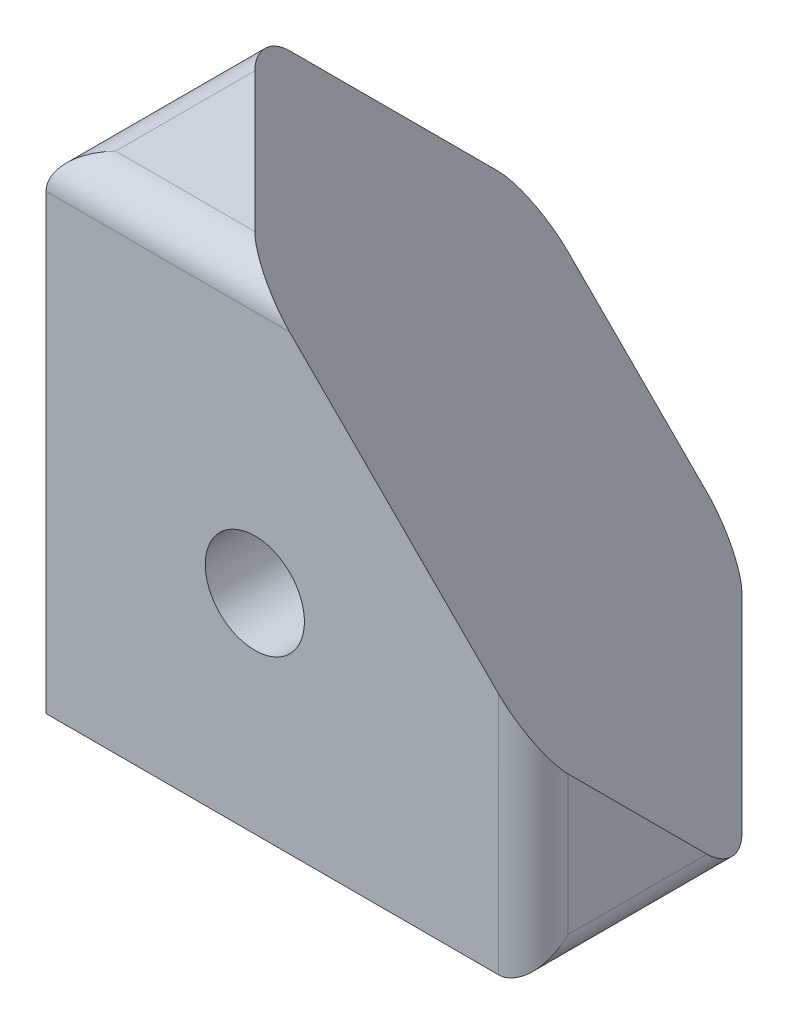
ISO-10303-21;
HEADER;
FILE_DESCRIPTION(('STEP AP214'),'2;1');
FILE_NAME('part.step','',(''),(''),'','','');
FILE_SCHEMA(('AUTOMOTIVE_DESIGN { 1 0 10303 214 1 1 1 1 }'));
ENDSEC;
DATA;
#1=APPLICATION_CONTEXT('core data for automotive mechanical design processes');
#2=APPLICATION_PROTOCOL_DEFINITION('international standard','automotive_design',2000,#1);
#3=PRODUCT_CONTEXT('',#1,'mechanical');
#4=PRODUCT('Part','Part','',(#3));
#5=PRODUCT_RELATED_PRODUCT_CATEGORY('part','',(#4));
#6=PRODUCT_DEFINITION_FORMATION('','',#4);
#7=PRODUCT_DEFINITION_CONTEXT('part definition',#1,'design');
#8=PRODUCT_DEFINITION('design','',#6,#7);
#9=PRODUCT_DEFINITION_SHAPE('','',#8);
#10=(LENGTH_UNIT() NAMED_UNIT(*) SI_UNIT(.MILLI.,.METRE.));
#11=(NAMED_UNIT(*) PLANE_ANGLE_UNIT() SI_UNIT($,.RADIAN.));
#12=(NAMED_UNIT(*) SI_UNIT($,.STERADIAN.) SOLID_ANGLE_UNIT());
#13=UNCERTAINTY_MEASURE_WITH_UNIT(LENGTH_MEASURE(1.E-05),#10,'distance_accuracy_value','');
#14=(GEOMETRIC_REPRESENTATION_CONTEXT(3) GLOBAL_UNCERTAINTY_ASSIGNED_CONTEXT((#13)) GLOBAL_UNIT_ASSIGNED_CONTEXT((#10,
#11,#12)) REPRESENTATION_CONTEXT('',''));
#15=CARTESIAN_POINT('',(0.,0.,0.));
#16=DIRECTION('',(0.,0.,1.));
#17=DIRECTION('',(1.,0.,0.));
#18=AXIS2_PLACEMENT_3D('',#15,#16,#17);
#19=CARTESIAN_POINT('',(0.,0.,0.));
#20=DIRECTION('',(-1.,0.,0.));
#21=DIRECTION('',(0.,0.,1.));
#22=AXIS2_PLACEMENT_3D('',#19,#20,#21);
#23=PLANE('',#22);
#24=CARTESIAN_POINT('',(0.,12.,-12.));
#25=DIRECTION('',(-1.,0.,0.));
#26=DIRECTION('',(0.,0.,1.));
#27=AXIS2_PLACEMENT_3D('',#24,#25,#26);
#28=CIRCLE('',#27,2.85);
#29=CARTESIAN_POINT('',(0.,12.,-9.15));
#30=VERTEX_POINT('',#29);
#31=EDGE_CURVE('E308',#30,#30,#28,.T.);
#32=ORIENTED_EDGE('',*,*,#31,.F.);
#33=EDGE_LOOP('',(#32));
#34=FACE_BOUND('',#33,.T.);
#35=DIRECTION('',(0.,0.707106781186548,0.707106781186548));
#36=VECTOR('',#35,1.);
#37=CARTESIAN_POINT('',(0.,40.,0.));
#38=LINE('',#37,#36);
#39=CARTESIAN_POINT('',(0.,14.,-26.));
#40=VERTEX_POINT('',#39);
#41=CARTESIAN_POINT('',(0.,26.,-14.));
#42=VERTEX_POINT('',#41);
#43=EDGE_CURVE('E139',#40,#42,#38,.T.);
#44=ORIENTED_EDGE('',*,*,#43,.F.);
#45=DIRECTION('',(0.,1.,0.));
#46=VECTOR('',#45,1.);
#47=CARTESIAN_POINT('',(0.,0.,-26.));
#48=LINE('',#47,#46);
#49=CARTESIAN_POINT('',(0.,0.,-26.));
#50=VERTEX_POINT('',#49);
#51=EDGE_CURVE('E155',#40,#50,#48,.F.);
#52=ORIENTED_EDGE('',*,*,#51,.T.);
#53=DIRECTION('',(0.,0.,-1.));
#54=VECTOR('',#53,1.);
#55=CARTESIAN_POINT('',(0.,0.,-40.));
#56=LINE('',#55,#54);
#57=CARTESIAN_POINT('',(0.,0.,0.));
#58=VERTEX_POINT('',#57);
#59=EDGE_CURVE('E140',#58,#50,#56,.T.);
#60=ORIENTED_EDGE('',*,*,#59,.F.);
#61=DIRECTION('',(0.,-1.,0.));
#62=VECTOR('',#61,1.);
#63=CARTESIAN_POINT('',(0.,0.,0.));
#64=LINE('',#63,#62);
#65=CARTESIAN_POINT('',(0.,26.,0.));
#66=VERTEX_POINT('',#65);
#67=EDGE_CURVE('E128',#66,#58,#64,.T.);
#68=ORIENTED_EDGE('',*,*,#67,.F.);
#69=DIRECTION('',(0.,0.,1.));
#70=VECTOR('',#69,1.);
#71=CARTESIAN_POINT('',(0.,26.,-12.));
#72=LINE('',#71,#70);
#73=EDGE_CURVE('E238',#66,#42,#72,.F.);
#74=ORIENTED_EDGE('',*,*,#73,.T.);
#75=EDGE_LOOP('',(#44,#52,#60,#68,#74));
#76=FACE_BOUND('',#75,.T.);
#77=ADVANCED_FACE('F49',(#34,#76),#23,.T.);
#78=CARTESIAN_POINT('',(0.,0.,0.));
#79=DIRECTION('',(0.,0.,-1.));
#80=DIRECTION('',(-1.,0.,0.));
#81=AXIS2_PLACEMENT_3D('',#78,#79,#80);
#82=PLANE('',#81);
#83=CARTESIAN_POINT('',(12.,12.,0.));
#84=DIRECTION('',(0.,0.,-1.));
#85=DIRECTION('',(-1.,0.,0.));
#86=AXIS2_PLACEMENT_3D('',#83,#84,#85);
#87=CIRCLE('',#86,2.85);
#88=CARTESIAN_POINT('',(9.15,12.,0.));
#89=VERTEX_POINT('',#88);
#90=EDGE_CURVE('E317',#89,#89,#87,.T.);
#91=ORIENTED_EDGE('',*,*,#90,.T.);
#92=EDGE_LOOP('',(#91));
#93=FACE_BOUND('',#92,.T.);
#94=DIRECTION('',(1.,0.,0.));
#95=VECTOR('',#94,1.);
#96=CARTESIAN_POINT('',(40.,0.,0.));
#97=LINE('',#96,#95);
#98=CARTESIAN_POINT('',(26.,0.,0.));
#99=VERTEX_POINT('',#98);
#100=EDGE_CURVE('E130',#58,#99,#97,.T.);
#101=ORIENTED_EDGE('',*,*,#100,.T.);
#102=DIRECTION('',(0.,-1.,0.));
#103=VECTOR('',#102,1.);
#104=CARTESIAN_POINT('',(26.,0.,0.));
#105=LINE('',#104,#103);
#106=CARTESIAN_POINT('',(26.,14.,0.));
#107=VERTEX_POINT('',#106);
#108=EDGE_CURVE('E212',#99,#107,#105,.F.);
#109=ORIENTED_EDGE('',*,*,#108,.T.);
#110=DIRECTION('',(-0.707106781186548,0.707106781186548,0.));
#111=VECTOR('',#110,1.);
#112=CARTESIAN_POINT('',(0.,40.,0.));
#113=LINE('',#112,#111);
#114=CARTESIAN_POINT('',(14.,26.,0.));
#115=VERTEX_POINT('',#114);
#116=EDGE_CURVE('E53',#107,#115,#113,.T.);
#117=ORIENTED_EDGE('',*,*,#116,.T.);
#118=DIRECTION('',(1.,0.,0.));
#119=VECTOR('',#118,1.);
#120=CARTESIAN_POINT('',(0.,26.,0.));
#121=LINE('',#120,#119);
#122=EDGE_CURVE('E134',#115,#66,#121,.F.);
#123=ORIENTED_EDGE('',*,*,#122,.T.);
#124=ORIENTED_EDGE('',*,*,#67,.T.);
#125=EDGE_LOOP('',(#101,#109,#117,#123,#124));
#126=FACE_BOUND('',#125,.T.);
#127=ADVANCED_FACE('F129',(#93,#126),#82,.F.);
#128=CARTESIAN_POINT('',(0.,40.,0.));
#129=DIRECTION('',(0.577350269189626,0.577350269189626,-0.577350269189626));
#130=DIRECTION('',(0.707106781186547,-0.707106781186547,0.));
#131=AXIS2_PLACEMENT_3D('',#128,#129,#130);
#132=PLANE('',#131);
#133=DIRECTION('',(0.707106781186548,-0.707106781186548,0.));
#134=VECTOR('',#133,1.);
#135=CARTESIAN_POINT('',(-14.,26.,-28.));
#136=LINE('',#135,#134);
#137=CARTESIAN_POINT('',(2.,9.99999999999997,-28.));
#138=VERTEX_POINT('',#137);
#139=CARTESIAN_POINT('',(9.99999999999998,2.,-28.));
#140=VERTEX_POINT('',#139);
#141=EDGE_CURVE('E320',#138,#140,#136,.T.);
#142=ORIENTED_EDGE('',*,*,#141,.F.);
#143=CARTESIAN_POINT('',(2.,12.,-26.));
#144=DIRECTION('',(0.577350269189626,0.577350269189626,-0.577350269189626));
#145=DIRECTION('',(0.408248290463863,-0.816496580927726,-0.408248290463863));
#146=AXIS2_PLACEMENT_3D('',#143,#144,#145);
#147=ELLIPSE('',#146,3.46410161513776,2.);
#148=EDGE_CURVE('E225',#138,#40,#147,.T.);
#149=ORIENTED_EDGE('',*,*,#148,.T.);
#150=ORIENTED_EDGE('',*,*,#43,.T.);
#151=CARTESIAN_POINT('',(2.,26.,-12.));
#152=DIRECTION('',(0.577350269189626,0.577350269189626,-0.577350269189626));
#153=DIRECTION('',(-0.408248290463863,-0.408248290463863,-0.816496580927726));
#154=AXIS2_PLACEMENT_3D('',#151,#152,#153);
#155=ELLIPSE('',#154,3.46410161513775,2.);
#156=CARTESIAN_POINT('',(2.,28.,-9.99999999999999));
#157=VERTEX_POINT('',#156);
#158=EDGE_CURVE('E220',#42,#157,#155,.T.);
#159=ORIENTED_EDGE('',*,*,#158,.T.);
#160=DIRECTION('',(-0.707106781186548,0.,-0.707106781186547));
#161=VECTOR('',#160,1.);
#162=CARTESIAN_POINT('',(5.99999999999999,28.,-6.));
#163=LINE('',#162,#161);
#164=CARTESIAN_POINT('',(10.,28.,-2.));
#165=VERTEX_POINT('',#164);
#166=EDGE_CURVE('E278',#165,#157,#163,.T.);
#167=ORIENTED_EDGE('',*,*,#166,.F.);
#168=CARTESIAN_POINT('',(12.,26.,-2.));
#169=DIRECTION('',(0.577350269189626,0.577350269189626,-0.577350269189626));
#170=DIRECTION('',(0.816496580927726,-0.408248290463863,0.408248290463863));
#171=AXIS2_PLACEMENT_3D('',#168,#169,#170);
#172=ELLIPSE('',#171,3.46410161513776,2.);
#173=EDGE_CURVE('E331',#165,#115,#172,.T.);
#174=ORIENTED_EDGE('',*,*,#173,.T.);
#175=ORIENTED_EDGE('',*,*,#116,.F.);
#176=CARTESIAN_POINT('',(26.,12.,-2.));
#177=DIRECTION('',(0.577350269189626,0.577350269189626,-0.577350269189626));
#178=DIRECTION('',(0.408248290463863,-0.816496580927726,-0.408248290463863));
#179=AXIS2_PLACEMENT_3D('',#176,#177,#178);
#180=ELLIPSE('',#179,3.46410161513776,2.);
#181=CARTESIAN_POINT('',(28.,10.,-1.99999999999999));
#182=VERTEX_POINT('',#181);
#183=EDGE_CURVE('E211',#107,#182,#180,.T.);
#184=ORIENTED_EDGE('',*,*,#183,.T.);
#185=DIRECTION('',(0.,0.707106781186548,0.707106781186547));
#186=VECTOR('',#185,1.);
#187=CARTESIAN_POINT('',(28.,26.,14.));
#188=LINE('',#187,#186);
#189=CARTESIAN_POINT('',(28.,2.,-9.99999999999999));
#190=VERTEX_POINT('',#189);
#191=EDGE_CURVE('E148',#190,#182,#188,.T.);
#192=ORIENTED_EDGE('',*,*,#191,.F.);
#193=CARTESIAN_POINT('',(26.,2.,-12.));
#194=DIRECTION('',(0.577350269189626,0.577350269189626,-0.577350269189626));
#195=DIRECTION('',(0.408248290463863,0.408248290463863,0.816496580927726));
#196=AXIS2_PLACEMENT_3D('',#193,#194,#195);
#197=ELLIPSE('',#196,3.46410161513775,2.);
#198=CARTESIAN_POINT('',(26.,0.,-14.));
#199=VERTEX_POINT('',#198);
#200=EDGE_CURVE('E221',#190,#199,#197,.T.);
#201=ORIENTED_EDGE('',*,*,#200,.T.);
#202=DIRECTION('',(-0.707106781186548,0.,-0.707106781186548));
#203=VECTOR('',#202,1.);
#204=CARTESIAN_POINT('',(20.,0.,-20.));
#205=LINE('',#204,#203);
#206=CARTESIAN_POINT('',(14.,0.,-26.));
#207=VERTEX_POINT('',#206);
#208=EDGE_CURVE('E157',#199,#207,#205,.T.);
#209=ORIENTED_EDGE('',*,*,#208,.T.);
#210=CARTESIAN_POINT('',(12.,2.,-26.));
#211=DIRECTION('',(0.577350269189626,0.577350269189626,-0.577350269189626));
#212=DIRECTION('',(0.816496580927726,-0.408248290463863,0.408248290463863));
#213=AXIS2_PLACEMENT_3D('',#210,#211,#212);
#214=ELLIPSE('',#213,3.46410161513776,2.);
#215=EDGE_CURVE('E227',#207,#140,#214,.T.);
#216=ORIENTED_EDGE('',*,*,#215,.T.);
#217=EDGE_LOOP('',(#142,#149,#150,#159,#167,#174,#175,#184,#192,#201,#209,#216));
#218=FACE_BOUND('',#217,.T.);
#219=ADVANCED_FACE('F260',(#218),#132,.T.);
#220=CARTESIAN_POINT('',(40.,0.,0.));
#221=DIRECTION('',(0.,-1.,0.));
#222=DIRECTION('',(-1.,0.,0.));
#223=AXIS2_PLACEMENT_3D('',#220,#221,#222);
#224=PLANE('',#223);
#225=CARTESIAN_POINT('',(12.,1.26565424807268E-13,-12.));
#226=DIRECTION('',(0.,1.,0.));
#227=DIRECTION('',(0.,0.,1.));
#228=AXIS2_PLACEMENT_3D('',#225,#226,#227);
#229=CIRCLE('',#228,2.85);
#230=CARTESIAN_POINT('',(12.,1.26565424807268E-13,-9.15));
#231=VERTEX_POINT('',#230);
#232=EDGE_CURVE('E456',#231,#231,#229,.T.);
#233=ORIENTED_EDGE('',*,*,#232,.T.);
#234=EDGE_LOOP('',(#233));
#235=FACE_BOUND('',#234,.T.);
#236=ORIENTED_EDGE('',*,*,#208,.F.);
#237=DIRECTION('',(0.,0.,-1.));
#238=VECTOR('',#237,1.);
#239=CARTESIAN_POINT('',(26.,0.,0.));
#240=LINE('',#239,#238);
#241=EDGE_CURVE('E12',#199,#99,#240,.F.);
#242=ORIENTED_EDGE('',*,*,#241,.T.);
#243=ORIENTED_EDGE('',*,*,#100,.F.);
#244=ORIENTED_EDGE('',*,*,#59,.T.);
#245=DIRECTION('',(-1.,0.,0.));
#246=VECTOR('',#245,1.);
#247=CARTESIAN_POINT('',(12.,0.,-26.));
#248=LINE('',#247,#246);
#249=EDGE_CURVE('E60',#50,#207,#248,.F.);
#250=ORIENTED_EDGE('',*,*,#249,.T.);
#251=EDGE_LOOP('',(#236,#242,#243,#244,#250));
#252=FACE_BOUND('',#251,.T.);
#253=ADVANCED_FACE('F144',(#235,#252),#224,.T.);
#254=CARTESIAN_POINT('',(28.,0.,-20.));
#255=DIRECTION('',(-1.,0.,0.));
#256=DIRECTION('',(0.,0.,1.));
#257=AXIS2_PLACEMENT_3D('',#254,#255,#256);
#258=PLANE('',#257);
#259=ORIENTED_EDGE('',*,*,#191,.T.);
#260=DIRECTION('',(0.,-1.,0.));
#261=VECTOR('',#260,1.);
#262=CARTESIAN_POINT('',(28.,0.,-2.));
#263=LINE('',#262,#261);
#264=CARTESIAN_POINT('',(28.,2.,-2.));
#265=VERTEX_POINT('',#264);
#266=EDGE_CURVE('E214',#182,#265,#263,.T.);
#267=ORIENTED_EDGE('',*,*,#266,.T.);
#268=DIRECTION('',(0.,0.,-1.));
#269=VECTOR('',#268,1.);
#270=CARTESIAN_POINT('',(28.,2.,-12.));
#271=LINE('',#270,#269);
#272=EDGE_CURVE('E394',#265,#190,#271,.T.);
#273=ORIENTED_EDGE('',*,*,#272,.T.);
#274=EDGE_LOOP('',(#259,#267,#273));
#275=FACE_BOUND('',#274,.T.);
#276=ADVANCED_FACE('F420',(#275),#258,.F.);
#277=CARTESIAN_POINT('',(0.,28.,-20.));
#278=DIRECTION('',(0.,-1.,0.));
#279=DIRECTION('',(1.,0.,0.));
#280=AXIS2_PLACEMENT_3D('',#277,#278,#279);
#281=PLANE('',#280);
#282=ORIENTED_EDGE('',*,*,#166,.T.);
#283=DIRECTION('',(0.,0.,1.));
#284=VECTOR('',#283,1.);
#285=CARTESIAN_POINT('',(2.,28.,0.));
#286=LINE('',#285,#284);
#287=CARTESIAN_POINT('',(2.,28.,-2.));
#288=VERTEX_POINT('',#287);
#289=EDGE_CURVE('E388',#157,#288,#286,.T.);
#290=ORIENTED_EDGE('',*,*,#289,.T.);
#291=DIRECTION('',(1.,0.,0.));
#292=VECTOR('',#291,1.);
#293=CARTESIAN_POINT('',(0.,28.,-2.));
#294=LINE('',#293,#292);
#295=EDGE_CURVE('E390',#288,#165,#294,.T.);
#296=ORIENTED_EDGE('',*,*,#295,.T.);
#297=EDGE_LOOP('',(#282,#290,#296));
#298=FACE_BOUND('',#297,.T.);
#299=ADVANCED_FACE('F262',(#298),#281,.F.);
#300=CARTESIAN_POINT('',(20.,0.,-28.));
#301=DIRECTION('',(0.,0.,1.));
#302=DIRECTION('',(1.,0.,0.));
#303=AXIS2_PLACEMENT_3D('',#300,#301,#302);
#304=PLANE('',#303);
#305=DIRECTION('',(-1.,0.,0.));
#306=VECTOR('',#305,1.);
#307=CARTESIAN_POINT('',(0.,2.,-28.));
#308=LINE('',#307,#306);
#309=CARTESIAN_POINT('',(2.,2.,-28.));
#310=VERTEX_POINT('',#309);
#311=EDGE_CURVE('E324',#140,#310,#308,.T.);
#312=ORIENTED_EDGE('',*,*,#311,.T.);
#313=DIRECTION('',(0.,1.,0.));
#314=VECTOR('',#313,1.);
#315=CARTESIAN_POINT('',(2.,12.,-28.));
#316=LINE('',#315,#314);
#317=EDGE_CURVE('E327',#310,#138,#316,.T.);
#318=ORIENTED_EDGE('',*,*,#317,.T.);
#319=ORIENTED_EDGE('',*,*,#141,.T.);
#320=EDGE_LOOP('',(#312,#318,#319));
#321=FACE_BOUND('',#320,.T.);
#322=ADVANCED_FACE('F191',(#321),#304,.F.);
#323=CARTESIAN_POINT('',(20.,2.,-26.));
#324=DIRECTION('',(1.,0.,0.));
#325=DIRECTION('',(0.,0.,-1.));
#326=AXIS2_PLACEMENT_3D('',#323,#324,#325);
#327=CYLINDRICAL_SURFACE('',#326,2.);
#328=ORIENTED_EDGE('',*,*,#215,.F.);
#329=ORIENTED_EDGE('',*,*,#249,.F.);
#330=CARTESIAN_POINT('',(2.,2.,-26.));
#331=DIRECTION('',(0.707106781186547,-0.707106781186547,0.));
#332=DIRECTION('',(0.707106781186547,0.707106781186547,0.));
#333=AXIS2_PLACEMENT_3D('',#330,#331,#332);
#334=ELLIPSE('',#333,2.82842712474619,2.);
#335=EDGE_CURVE('E306',#310,#50,#334,.F.);
#336=ORIENTED_EDGE('',*,*,#335,.F.);
#337=ORIENTED_EDGE('',*,*,#311,.F.);
#338=EDGE_LOOP('',(#328,#329,#336,#337));
#339=FACE_BOUND('',#338,.T.);
#340=ADVANCED_FACE('F187',(#339),#327,.T.);
#341=CARTESIAN_POINT('',(2.,0.,-26.));
#342=DIRECTION('',(0.,-1.,0.));
#343=DIRECTION('',(0.,0.,-1.));
#344=AXIS2_PLACEMENT_3D('',#341,#342,#343);
#345=CYLINDRICAL_SURFACE('',#344,2.);
#346=ORIENTED_EDGE('',*,*,#335,.T.);
#347=ORIENTED_EDGE('',*,*,#51,.F.);
#348=ORIENTED_EDGE('',*,*,#148,.F.);
#349=ORIENTED_EDGE('',*,*,#317,.F.);
#350=EDGE_LOOP('',(#346,#347,#348,#349));
#351=FACE_BOUND('',#350,.T.);
#352=ADVANCED_FACE('F182',(#351),#345,.T.);
#353=CARTESIAN_POINT('',(0.,26.,-2.));
#354=DIRECTION('',(1.,0.,0.));
#355=DIRECTION('',(0.,1.,0.));
#356=AXIS2_PLACEMENT_3D('',#353,#354,#355);
#357=CYLINDRICAL_SURFACE('',#356,2.);
#358=ORIENTED_EDGE('',*,*,#173,.F.);
#359=ORIENTED_EDGE('',*,*,#295,.F.);
#360=CARTESIAN_POINT('',(2.,26.,-2.));
#361=DIRECTION('',(0.707106781186547,0.,0.707106781186547));
#362=DIRECTION('',(0.707106781186547,0.,-0.707106781186547));
#363=AXIS2_PLACEMENT_3D('',#360,#361,#362);
#364=ELLIPSE('',#363,2.82842712474619,2.);
#365=EDGE_CURVE('E301',#66,#288,#364,.F.);
#366=ORIENTED_EDGE('',*,*,#365,.F.);
#367=ORIENTED_EDGE('',*,*,#122,.F.);
#368=EDGE_LOOP('',(#358,#359,#366,#367));
#369=FACE_BOUND('',#368,.T.);
#370=ADVANCED_FACE('F186',(#369),#357,.T.);
#371=CARTESIAN_POINT('',(2.,26.,-20.));
#372=DIRECTION('',(0.,0.,-1.));
#373=DIRECTION('',(-1.,0.,0.));
#374=AXIS2_PLACEMENT_3D('',#371,#372,#373);
#375=CYLINDRICAL_SURFACE('',#374,2.);
#376=ORIENTED_EDGE('',*,*,#158,.F.);
#377=ORIENTED_EDGE('',*,*,#73,.F.);
#378=ORIENTED_EDGE('',*,*,#365,.T.);
#379=ORIENTED_EDGE('',*,*,#289,.F.);
#380=EDGE_LOOP('',(#376,#377,#378,#379));
#381=FACE_BOUND('',#380,.T.);
#382=ADVANCED_FACE('F193',(#381),#375,.T.);
#383=CARTESIAN_POINT('',(26.,2.,-20.));
#384=DIRECTION('',(0.,0.,1.));
#385=DIRECTION('',(1.,0.,0.));
#386=AXIS2_PLACEMENT_3D('',#383,#384,#385);
#387=CYLINDRICAL_SURFACE('',#386,2.);
#388=ORIENTED_EDGE('',*,*,#200,.F.);
#389=ORIENTED_EDGE('',*,*,#272,.F.);
#390=CARTESIAN_POINT('',(26.,2.,-2.));
#391=DIRECTION('',(0.,0.707106781186547,0.707106781186547));
#392=DIRECTION('',(0.,-0.707106781186547,0.707106781186547));
#393=AXIS2_PLACEMENT_3D('',#390,#391,#392);
#394=ELLIPSE('',#393,2.82842712474619,2.);
#395=EDGE_CURVE('E74',#99,#265,#394,.T.);
#396=ORIENTED_EDGE('',*,*,#395,.F.);
#397=ORIENTED_EDGE('',*,*,#241,.F.);
#398=EDGE_LOOP('',(#388,#389,#396,#397));
#399=FACE_BOUND('',#398,.T.);
#400=ADVANCED_FACE('F51',(#399),#387,.T.);
#401=CARTESIAN_POINT('',(26.,0.,-2.));
#402=DIRECTION('',(0.,-1.,0.));
#403=DIRECTION('',(0.,0.,-1.));
#404=AXIS2_PLACEMENT_3D('',#401,#402,#403);
#405=CYLINDRICAL_SURFACE('',#404,2.);
#406=ORIENTED_EDGE('',*,*,#183,.F.);
#407=ORIENTED_EDGE('',*,*,#108,.F.);
#408=ORIENTED_EDGE('',*,*,#395,.T.);
#409=ORIENTED_EDGE('',*,*,#266,.F.);
#410=EDGE_LOOP('',(#406,#407,#408,#409));
#411=FACE_BOUND('',#410,.T.);
#412=ADVANCED_FACE('F199',(#411),#405,.T.);
#413=CARTESIAN_POINT('',(8.,12.,-12.));
#414=DIRECTION('',(-1.,0.,0.));
#415=DIRECTION('',(0.,0.,1.));
#416=AXIS2_PLACEMENT_3D('',#413,#414,#415);
#417=CYLINDRICAL_SURFACE('',#416,2.85);
#418=CARTESIAN_POINT('',(8.,12.,-12.));
#419=DIRECTION('',(-1.,0.,0.));
#420=DIRECTION('',(0.,0.,1.));
#421=AXIS2_PLACEMENT_3D('',#418,#419,#420);
#422=CIRCLE('',#421,2.85);
#423=CARTESIAN_POINT('',(8.,12.,-9.15));
#424=VERTEX_POINT('',#423);
#425=EDGE_CURVE('E302',#424,#424,#422,.T.);
#426=ORIENTED_EDGE('',*,*,#425,.F.);
#427=EDGE_LOOP('',(#426));
#428=FACE_BOUND('',#427,.T.);
#429=ORIENTED_EDGE('',*,*,#31,.T.);
#430=EDGE_LOOP('',(#429));
#431=FACE_BOUND('',#430,.T.);
#432=ADVANCED_FACE('F201',(#428,#431),#417,.F.);
#433=CARTESIAN_POINT('',(8.,12.,-12.));
#434=DIRECTION('',(-1.,0.,0.));
#435=DIRECTION('',(0.,0.,1.));
#436=AXIS2_PLACEMENT_3D('',#433,#434,#435);
#437=PLANE('',#436);
#438=ORIENTED_EDGE('',*,*,#425,.T.);
#439=EDGE_LOOP('',(#438));
#440=FACE_BOUND('',#439,.T.);
#441=ADVANCED_FACE('F206',(#440),#437,.T.);
#442=CARTESIAN_POINT('',(12.,12.,-7.99999999999996));
#443=DIRECTION('',(0.,0.,1.));
#444=DIRECTION('',(1.,0.,0.));
#445=AXIS2_PLACEMENT_3D('',#442,#443,#444);
#446=CYLINDRICAL_SURFACE('',#445,2.85);
#447=CARTESIAN_POINT('',(12.,12.,-7.99999999999996));
#448=DIRECTION('',(0.,0.,-1.));
#449=DIRECTION('',(-1.,0.,0.));
#450=AXIS2_PLACEMENT_3D('',#447,#448,#449);
#451=CIRCLE('',#450,2.85);
#452=CARTESIAN_POINT('',(9.15000000000003,12.,-7.99999999999997));
#453=VERTEX_POINT('',#452);
#454=EDGE_CURVE('E314',#453,#453,#451,.T.);
#455=ORIENTED_EDGE('',*,*,#454,.T.);
#456=EDGE_LOOP('',(#455));
#457=FACE_BOUND('',#456,.T.);
#458=ORIENTED_EDGE('',*,*,#90,.F.);
#459=EDGE_LOOP('',(#458));
#460=FACE_BOUND('',#459,.T.);
#461=ADVANCED_FACE('F435',(#457,#460),#446,.F.);
#462=CARTESIAN_POINT('',(12.,12.,-7.99999999999996));
#463=DIRECTION('',(0.,0.,1.));
#464=DIRECTION('',(-1.,0.,0.));
#465=AXIS2_PLACEMENT_3D('',#462,#463,#464);
#466=PLANE('',#465);
#467=ORIENTED_EDGE('',*,*,#454,.F.);
#468=EDGE_LOOP('',(#467));
#469=FACE_BOUND('',#468,.T.);
#470=ADVANCED_FACE('F438',(#469),#466,.T.);
#471=CARTESIAN_POINT('',(11.9999999999999,8.00000000000013,-12.));
#472=DIRECTION('',(0.,-1.,0.));
#473=DIRECTION('',(1.,0.,0.));
#474=AXIS2_PLACEMENT_3D('',#471,#472,#473);
#475=CYLINDRICAL_SURFACE('',#474,2.85);
#476=CARTESIAN_POINT('',(11.9999999999999,8.00000000000013,-12.));
#477=DIRECTION('',(0.,1.,0.));
#478=DIRECTION('',(0.,0.,1.));
#479=AXIS2_PLACEMENT_3D('',#476,#477,#478);
#480=CIRCLE('',#479,2.85);
#481=CARTESIAN_POINT('',(11.9999999999999,8.00000000000013,-9.15));
#482=VERTEX_POINT('',#481);
#483=EDGE_CURVE('E454',#482,#482,#480,.T.);
#484=ORIENTED_EDGE('',*,*,#483,.T.);
#485=EDGE_LOOP('',(#484));
#486=FACE_BOUND('',#485,.T.);
#487=ORIENTED_EDGE('',*,*,#232,.F.);
#488=EDGE_LOOP('',(#487));
#489=FACE_BOUND('',#488,.T.);
#490=ADVANCED_FACE('F442',(#486,#489),#475,.F.);
#491=CARTESIAN_POINT('',(11.9999999999999,8.00000000000013,-12.));
#492=DIRECTION('',(0.,-1.,0.));
#493=DIRECTION('',(0.,0.,1.));
#494=AXIS2_PLACEMENT_3D('',#491,#492,#493);
#495=PLANE('',#494);
#496=ORIENTED_EDGE('',*,*,#483,.F.);
#497=EDGE_LOOP('',(#496));
#498=FACE_BOUND('',#497,.T.);
#499=ADVANCED_FACE('F446',(#498),#495,.T.);
#500=CLOSED_SHELL('',(#77,#127,#219,#253,#276,#299,#322,#340,#352,#370,#382,#400,#412,#432,#441,
#461,#470,#490,#499));
#501=MANIFOLD_SOLID_BREP('B2',#500);
#502=ADVANCED_BREP_SHAPE_REPRESENTATION('',(#18,#501),#14);
#503=SHAPE_DEFINITION_REPRESENTATION(#9,#502);
ENDSEC;
END-ISO-10303-21;
